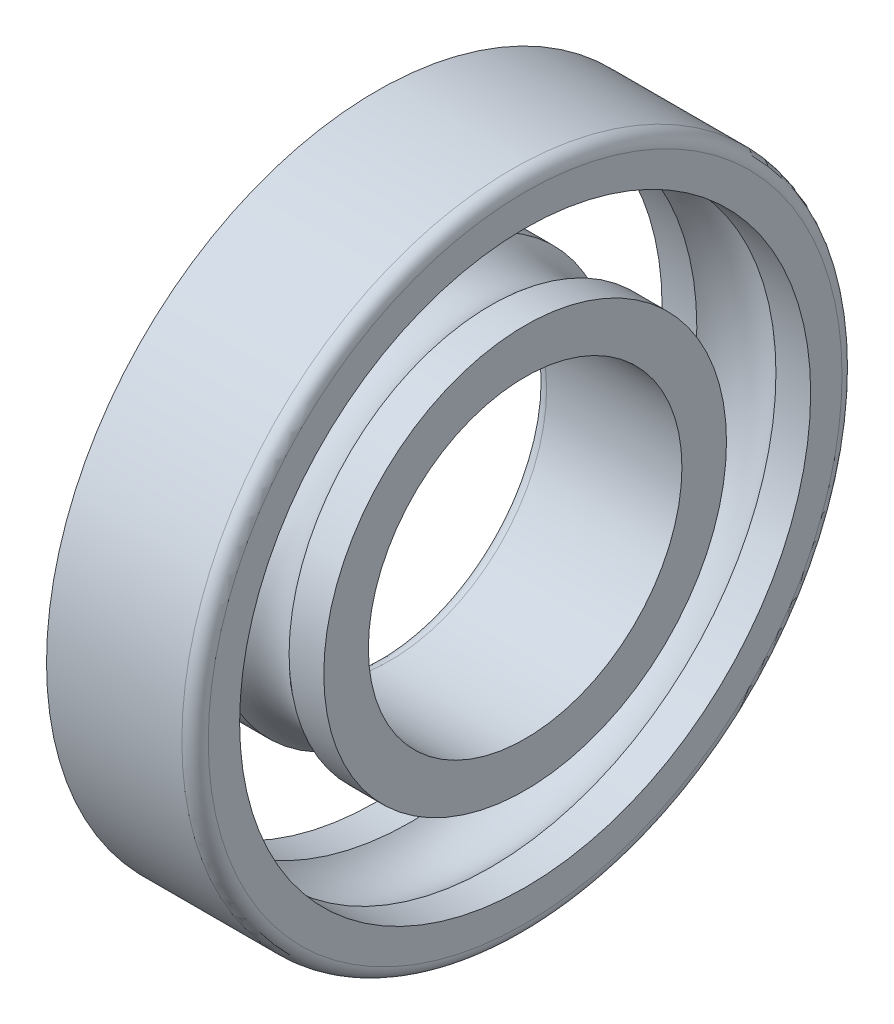
ISO-10303-21;
HEADER;
FILE_DESCRIPTION(('STEP AP214'),'2;1');
FILE_NAME('part.step','',(''),(''),'','','');
FILE_SCHEMA(('AUTOMOTIVE_DESIGN { 1 0 10303 214 1 1 1 1 }'));
ENDSEC;
DATA;
#1=APPLICATION_CONTEXT('core data for automotive mechanical design processes');
#2=APPLICATION_PROTOCOL_DEFINITION('international standard','automotive_design',2000,#1);
#3=PRODUCT_CONTEXT('',#1,'mechanical');
#4=PRODUCT('Part','Part','',(#3));
#5=PRODUCT_RELATED_PRODUCT_CATEGORY('part','',(#4));
#6=PRODUCT_DEFINITION_FORMATION('','',#4);
#7=PRODUCT_DEFINITION_CONTEXT('part definition',#1,'design');
#8=PRODUCT_DEFINITION('design','',#6,#7);
#9=PRODUCT_DEFINITION_SHAPE('','',#8);
#10=(LENGTH_UNIT() NAMED_UNIT(*) SI_UNIT(.MILLI.,.METRE.));
#11=(NAMED_UNIT(*) PLANE_ANGLE_UNIT() SI_UNIT($,.RADIAN.));
#12=(NAMED_UNIT(*) SI_UNIT($,.STERADIAN.) SOLID_ANGLE_UNIT());
#13=UNCERTAINTY_MEASURE_WITH_UNIT(LENGTH_MEASURE(1.E-05),#10,'distance_accuracy_value','');
#14=(GEOMETRIC_REPRESENTATION_CONTEXT(3) GLOBAL_UNCERTAINTY_ASSIGNED_CONTEXT((#13)) GLOBAL_UNIT_ASSIGNED_CONTEXT((#10,
#11,#12)) REPRESENTATION_CONTEXT('',''));
#15=CARTESIAN_POINT('',(0.,0.,0.));
#16=DIRECTION('',(0.,0.,1.));
#17=DIRECTION('',(1.,0.,0.));
#18=AXIS2_PLACEMENT_3D('',#15,#16,#17);
#19=CARTESIAN_POINT('',(-22.5,61.,0.));
#20=DIRECTION('',(1.,0.,0.));
#21=DIRECTION('',(0.,0.,-1.));
#22=AXIS2_PLACEMENT_3D('',#19,#20,#21);
#23=PLANE('',#22);
#24=CARTESIAN_POINT('',(-22.5,0.,0.));
#25=DIRECTION('',(1.,0.,0.));
#26=DIRECTION('',(0.,0.,-1.));
#27=AXIS2_PLACEMENT_3D('',#24,#25,#26);
#28=CIRCLE('',#27,51.5);
#29=CARTESIAN_POINT('',(-22.5,0.,-51.5));
#30=VERTEX_POINT('',#29);
#31=EDGE_CURVE('E11',#30,#30,#28,.T.);
#32=ORIENTED_EDGE('',*,*,#31,.T.);
#33=EDGE_LOOP('',(#32));
#34=FACE_BOUND('',#33,.T.);
#35=CARTESIAN_POINT('',(-22.5,0.,0.));
#36=DIRECTION('',(-1.,0.,0.));
#37=DIRECTION('',(0.,0.,1.));
#38=AXIS2_PLACEMENT_3D('',#35,#36,#37);
#39=CIRCLE('',#38,61.);
#40=CARTESIAN_POINT('',(-22.5,0.,61.));
#41=VERTEX_POINT('',#40);
#42=EDGE_CURVE('E65',#41,#41,#39,.T.);
#43=ORIENTED_EDGE('',*,*,#42,.T.);
#44=EDGE_LOOP('',(#43));
#45=FACE_BOUND('',#44,.T.);
#46=ADVANCED_FACE('F40',(#34,#45),#23,.F.);
#47=CARTESIAN_POINT('',(-49.6592848525322,0.,0.));
#48=DIRECTION('',(-1.,0.,0.));
#49=DIRECTION('',(0.,0.,1.));
#50=AXIS2_PLACEMENT_3D('',#47,#48,#49);
#51=CYLINDRICAL_SURFACE('',#50,47.5);
#52=CARTESIAN_POINT('',(-18.5,0.,0.));
#53=DIRECTION('',(1.,0.,0.));
#54=DIRECTION('',(0.,0.,-1.));
#55=AXIS2_PLACEMENT_3D('',#52,#53,#54);
#56=CIRCLE('',#55,47.5);
#57=CARTESIAN_POINT('',(-18.5,0.,-47.5));
#58=VERTEX_POINT('',#57);
#59=EDGE_CURVE('E46',#58,#58,#56,.F.);
#60=ORIENTED_EDGE('',*,*,#59,.T.);
#61=EDGE_LOOP('',(#60));
#62=FACE_BOUND('',#61,.T.);
#63=CARTESIAN_POINT('',(22.5,0.,0.));
#64=DIRECTION('',(-1.,0.,0.));
#65=DIRECTION('',(0.,0.,1.));
#66=AXIS2_PLACEMENT_3D('',#63,#64,#65);
#67=CIRCLE('',#66,47.5);
#68=CARTESIAN_POINT('',(22.5,0.,47.5));
#69=VERTEX_POINT('',#68);
#70=EDGE_CURVE('E50',#69,#69,#67,.T.);
#71=ORIENTED_EDGE('',*,*,#70,.F.);
#72=EDGE_LOOP('',(#71));
#73=FACE_BOUND('',#72,.T.);
#74=ADVANCED_FACE('F92',(#62,#73),#51,.F.);
#75=CARTESIAN_POINT('',(22.5,61.,0.));
#76=DIRECTION('',(-1.,0.,0.));
#77=DIRECTION('',(0.,0.,1.));
#78=AXIS2_PLACEMENT_3D('',#75,#76,#77);
#79=PLANE('',#78);
#80=CARTESIAN_POINT('',(22.5,0.,0.));
#81=DIRECTION('',(-1.,0.,0.));
#82=DIRECTION('',(0.,0.,1.));
#83=AXIS2_PLACEMENT_3D('',#80,#81,#82);
#84=CIRCLE('',#83,61.);
#85=CARTESIAN_POINT('',(22.5,0.,61.));
#86=VERTEX_POINT('',#85);
#87=EDGE_CURVE('E54',#86,#86,#84,.T.);
#88=ORIENTED_EDGE('',*,*,#87,.F.);
#89=EDGE_LOOP('',(#88));
#90=FACE_BOUND('',#89,.T.);
#91=ORIENTED_EDGE('',*,*,#70,.T.);
#92=EDGE_LOOP('',(#91));
#93=FACE_BOUND('',#92,.T.);
#94=ADVANCED_FACE('F86',(#90,#93),#79,.F.);
#95=CARTESIAN_POINT('',(-49.6592848525322,0.,0.));
#96=DIRECTION('',(-1.,0.,0.));
#97=DIRECTION('',(0.,0.,1.));
#98=AXIS2_PLACEMENT_3D('',#95,#96,#97);
#99=CYLINDRICAL_SURFACE('',#98,61.);
#100=CARTESIAN_POINT('',(11.9869720947368,0.,0.));
#101=DIRECTION('',(-1.,0.,0.));
#102=DIRECTION('',(0.,0.,1.));
#103=AXIS2_PLACEMENT_3D('',#100,#101,#102);
#104=CIRCLE('',#103,61.);
#105=CARTESIAN_POINT('',(11.9869720947368,0.,61.));
#106=VERTEX_POINT('',#105);
#107=EDGE_CURVE('E59',#106,#106,#104,.T.);
#108=ORIENTED_EDGE('',*,*,#107,.F.);
#109=EDGE_LOOP('',(#108));
#110=FACE_BOUND('',#109,.T.);
#111=ORIENTED_EDGE('',*,*,#87,.T.);
#112=EDGE_LOOP('',(#111));
#113=FACE_BOUND('',#112,.T.);
#114=ADVANCED_FACE('F80',(#110,#113),#99,.T.);
#115=CARTESIAN_POINT('',(0.,0.,0.));
#116=DIRECTION('',(-1.,0.,0.));
#117=DIRECTION('',(0.,0.,1.));
#118=AXIS2_PLACEMENT_3D('',#115,#116,#117);
#119=TOROIDAL_SURFACE('',#118,73.75,17.5);
#120=CARTESIAN_POINT('',(-11.9869720947369,0.,0.));
#121=DIRECTION('',(-1.,0.,0.));
#122=DIRECTION('',(0.,0.,1.));
#123=AXIS2_PLACEMENT_3D('',#120,#121,#122);
#124=CIRCLE('',#123,61.);
#125=CARTESIAN_POINT('',(-11.9869720947369,0.,61.));
#126=VERTEX_POINT('',#125);
#127=EDGE_CURVE('E62',#126,#126,#124,.T.);
#128=ORIENTED_EDGE('',*,*,#127,.F.);
#129=EDGE_LOOP('',(#128));
#130=FACE_BOUND('',#129,.T.);
#131=ORIENTED_EDGE('',*,*,#107,.T.);
#132=EDGE_LOOP('',(#131));
#133=FACE_BOUND('',#132,.T.);
#134=ADVANCED_FACE('F74',(#130,#133),#119,.F.);
#135=CARTESIAN_POINT('',(-49.6592848525322,0.,0.));
#136=DIRECTION('',(-1.,0.,0.));
#137=DIRECTION('',(0.,0.,1.));
#138=AXIS2_PLACEMENT_3D('',#135,#136,#137);
#139=CYLINDRICAL_SURFACE('',#138,61.);
#140=ORIENTED_EDGE('',*,*,#42,.F.);
#141=EDGE_LOOP('',(#140));
#142=FACE_BOUND('',#141,.T.);
#143=ORIENTED_EDGE('',*,*,#127,.T.);
#144=EDGE_LOOP('',(#143));
#145=FACE_BOUND('',#144,.T.);
#146=ADVANCED_FACE('F70',(#142,#145),#139,.T.);
#147=CARTESIAN_POINT('',(-18.5,0.,0.));
#148=DIRECTION('',(1.,0.,0.));
#149=DIRECTION('',(0.,0.,-1.));
#150=AXIS2_PLACEMENT_3D('',#147,#148,#149);
#151=TOROIDAL_SURFACE('',#150,51.5,4.);
#152=ORIENTED_EDGE('',*,*,#31,.F.);
#153=EDGE_LOOP('',(#152));
#154=FACE_BOUND('',#153,.T.);
#155=ORIENTED_EDGE('',*,*,#59,.F.);
#156=EDGE_LOOP('',(#155));
#157=FACE_BOUND('',#156,.T.);
#158=ADVANCED_FACE('F73',(#154,#157),#151,.T.);
#159=CLOSED_SHELL('',(#46,#74,#94,#114,#134,#146,#158));
#160=MANIFOLD_SOLID_BREP('B2',#159);
#161=CARTESIAN_POINT('',(-22.5,100.,0.));
#162=DIRECTION('',(1.,0.,0.));
#163=DIRECTION('',(0.,0.,-1.));
#164=AXIS2_PLACEMENT_3D('',#161,#162,#163);
#165=PLANE('',#164);
#166=CARTESIAN_POINT('',(-22.5,0.,0.));
#167=DIRECTION('',(-1.,0.,0.));
#168=DIRECTION('',(0.,0.,1.));
#169=AXIS2_PLACEMENT_3D('',#166,#167,#168);
#170=CIRCLE('',#169,86.5);
#171=CARTESIAN_POINT('',(-22.5,0.,86.5));
#172=VERTEX_POINT('',#171);
#173=EDGE_CURVE('E156',#172,#172,#170,.T.);
#174=ORIENTED_EDGE('',*,*,#173,.F.);
#175=EDGE_LOOP('',(#174));
#176=FACE_BOUND('',#175,.T.);
#177=CARTESIAN_POINT('',(-22.5,0.,0.));
#178=DIRECTION('',(-1.,0.,0.));
#179=DIRECTION('',(0.,0.,1.));
#180=AXIS2_PLACEMENT_3D('',#177,#178,#179);
#181=CIRCLE('',#180,100.);
#182=CARTESIAN_POINT('',(-22.5,0.,100.));
#183=VERTEX_POINT('',#182);
#184=EDGE_CURVE('E171',#183,#183,#181,.T.);
#185=ORIENTED_EDGE('',*,*,#184,.T.);
#186=EDGE_LOOP('',(#185));
#187=FACE_BOUND('',#186,.T.);
#188=ADVANCED_FACE('F146',(#176,#187),#165,.F.);
#189=CARTESIAN_POINT('',(-49.6592848525322,0.,0.));
#190=DIRECTION('',(-1.,0.,0.));
#191=DIRECTION('',(0.,0.,1.));
#192=AXIS2_PLACEMENT_3D('',#189,#190,#191);
#193=CYLINDRICAL_SURFACE('',#192,86.5);
#194=CARTESIAN_POINT('',(-11.9869720947368,0.,0.));
#195=DIRECTION('',(-1.,0.,0.));
#196=DIRECTION('',(0.,0.,1.));
#197=AXIS2_PLACEMENT_3D('',#194,#195,#196);
#198=CIRCLE('',#197,86.5);
#199=CARTESIAN_POINT('',(-11.9869720947368,0.,86.5));
#200=VERTEX_POINT('',#199);
#201=EDGE_CURVE('E160',#200,#200,#198,.T.);
#202=ORIENTED_EDGE('',*,*,#201,.F.);
#203=EDGE_LOOP('',(#202));
#204=FACE_BOUND('',#203,.T.);
#205=ORIENTED_EDGE('',*,*,#173,.T.);
#206=EDGE_LOOP('',(#205));
#207=FACE_BOUND('',#206,.T.);
#208=ADVANCED_FACE('F190',(#204,#207),#193,.F.);
#209=CARTESIAN_POINT('',(0.,0.,0.));
#210=DIRECTION('',(-1.,0.,0.));
#211=DIRECTION('',(0.,0.,1.));
#212=AXIS2_PLACEMENT_3D('',#209,#210,#211);
#213=TOROIDAL_SURFACE('',#212,73.75,17.5);
#214=CARTESIAN_POINT('',(11.9869720947368,0.,0.));
#215=DIRECTION('',(-1.,0.,0.));
#216=DIRECTION('',(0.,0.,1.));
#217=AXIS2_PLACEMENT_3D('',#214,#215,#216);
#218=CIRCLE('',#217,86.5);
#219=CARTESIAN_POINT('',(11.9869720947368,0.,86.5));
#220=VERTEX_POINT('',#219);
#221=EDGE_CURVE('E165',#220,#220,#218,.T.);
#222=ORIENTED_EDGE('',*,*,#221,.F.);
#223=EDGE_LOOP('',(#222));
#224=FACE_BOUND('',#223,.T.);
#225=ORIENTED_EDGE('',*,*,#201,.T.);
#226=EDGE_LOOP('',(#225));
#227=FACE_BOUND('',#226,.T.);
#228=ADVANCED_FACE('F195',(#224,#227),#213,.F.);
#229=CARTESIAN_POINT('',(-49.6592848525322,0.,0.));
#230=DIRECTION('',(-1.,0.,0.));
#231=DIRECTION('',(0.,0.,1.));
#232=AXIS2_PLACEMENT_3D('',#229,#230,#231);
#233=CYLINDRICAL_SURFACE('',#232,86.5);
#234=CARTESIAN_POINT('',(22.5,0.,0.));
#235=DIRECTION('',(-1.,0.,0.));
#236=DIRECTION('',(0.,0.,1.));
#237=AXIS2_PLACEMENT_3D('',#234,#235,#236);
#238=CIRCLE('',#237,86.5);
#239=CARTESIAN_POINT('',(22.5,0.,86.5));
#240=VERTEX_POINT('',#239);
#241=EDGE_CURVE('E168',#240,#240,#238,.T.);
#242=ORIENTED_EDGE('',*,*,#241,.F.);
#243=EDGE_LOOP('',(#242));
#244=FACE_BOUND('',#243,.T.);
#245=ORIENTED_EDGE('',*,*,#221,.T.);
#246=EDGE_LOOP('',(#245));
#247=FACE_BOUND('',#246,.T.);
#248=ADVANCED_FACE('F187',(#244,#247),#233,.F.);
#249=CARTESIAN_POINT('',(22.5,100.,0.));
#250=DIRECTION('',(-1.,0.,0.));
#251=DIRECTION('',(0.,0.,1.));
#252=AXIS2_PLACEMENT_3D('',#249,#250,#251);
#253=PLANE('',#252);
#254=CARTESIAN_POINT('',(22.5,0.,0.));
#255=DIRECTION('',(-1.,0.,0.));
#256=DIRECTION('',(0.,0.,1.));
#257=AXIS2_PLACEMENT_3D('',#254,#255,#256);
#258=CIRCLE('',#257,96.);
#259=CARTESIAN_POINT('',(22.5,0.,96.));
#260=VERTEX_POINT('',#259);
#261=EDGE_CURVE('E39',#260,#260,#258,.F.);
#262=ORIENTED_EDGE('',*,*,#261,.T.);
#263=EDGE_LOOP('',(#262));
#264=FACE_BOUND('',#263,.T.);
#265=ORIENTED_EDGE('',*,*,#241,.T.);
#266=EDGE_LOOP('',(#265));
#267=FACE_BOUND('',#266,.T.);
#268=ADVANCED_FACE('F179',(#264,#267),#253,.F.);
#269=CARTESIAN_POINT('',(-49.6592848525322,0.,0.));
#270=DIRECTION('',(-1.,0.,0.));
#271=DIRECTION('',(0.,0.,1.));
#272=AXIS2_PLACEMENT_3D('',#269,#270,#271);
#273=CYLINDRICAL_SURFACE('',#272,100.);
#274=CARTESIAN_POINT('',(18.5,0.,0.));
#275=DIRECTION('',(-1.,0.,0.));
#276=DIRECTION('',(0.,0.,1.));
#277=AXIS2_PLACEMENT_3D('',#274,#275,#276);
#278=CIRCLE('',#277,100.);
#279=CARTESIAN_POINT('',(18.5,0.,100.));
#280=VERTEX_POINT('',#279);
#281=EDGE_CURVE('E152',#280,#280,#278,.T.);
#282=ORIENTED_EDGE('',*,*,#281,.T.);
#283=EDGE_LOOP('',(#282));
#284=FACE_BOUND('',#283,.T.);
#285=ORIENTED_EDGE('',*,*,#184,.F.);
#286=EDGE_LOOP('',(#285));
#287=FACE_BOUND('',#286,.T.);
#288=ADVANCED_FACE('F176',(#284,#287),#273,.T.);
#289=CARTESIAN_POINT('',(18.5,0.,0.));
#290=DIRECTION('',(-1.,0.,0.));
#291=DIRECTION('',(0.,0.,1.));
#292=AXIS2_PLACEMENT_3D('',#289,#290,#291);
#293=TOROIDAL_SURFACE('',#292,96.,4.);
#294=ORIENTED_EDGE('',*,*,#261,.F.);
#295=EDGE_LOOP('',(#294));
#296=FACE_BOUND('',#295,.T.);
#297=ORIENTED_EDGE('',*,*,#281,.F.);
#298=EDGE_LOOP('',(#297));
#299=FACE_BOUND('',#298,.T.);
#300=ADVANCED_FACE('F178',(#296,#299),#293,.T.);
#301=CLOSED_SHELL('',(#188,#208,#228,#248,#268,#288,#300));
#302=MANIFOLD_SOLID_BREP('B6',#301);
#303=ADVANCED_BREP_SHAPE_REPRESENTATION('',(#18,#160,#302),#14);
#304=SHAPE_DEFINITION_REPRESENTATION(#9,#303);
ENDSEC;
END-ISO-10303-21;
